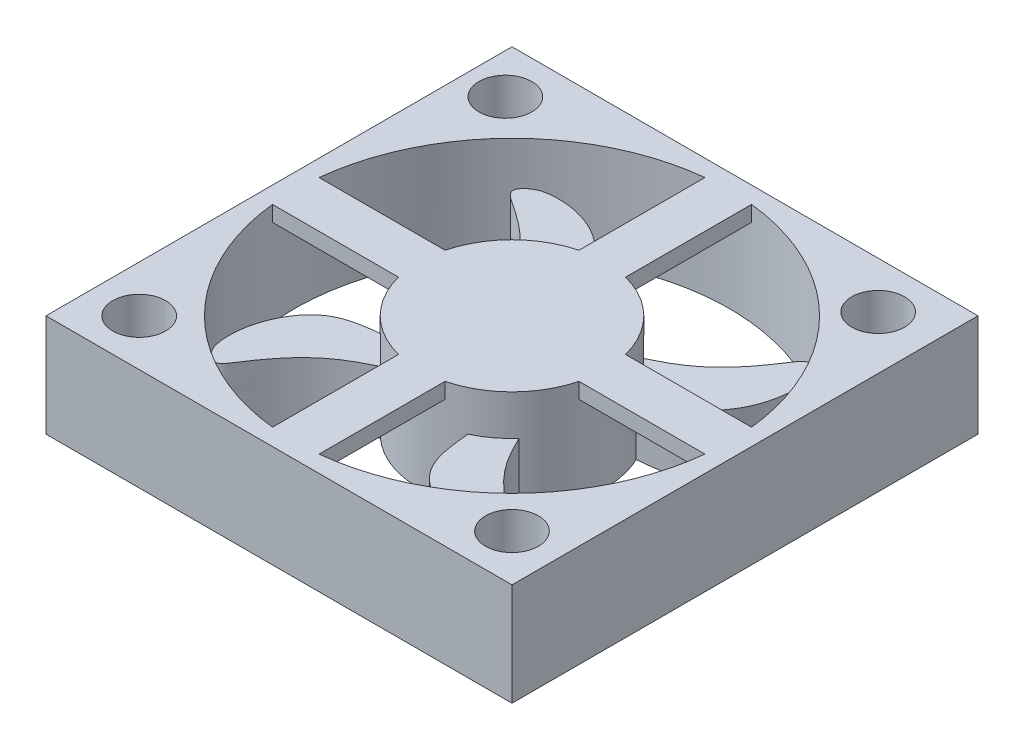
ISO-10303-21;
HEADER;
FILE_DESCRIPTION(('STEP AP214'),'2;1');
FILE_NAME('part.step','',(''),(''),'','','');
FILE_SCHEMA(('AUTOMOTIVE_DESIGN { 1 0 10303 214 1 1 1 1 }'));
ENDSEC;
DATA;
#1=APPLICATION_CONTEXT('core data for automotive mechanical design processes');
#2=APPLICATION_PROTOCOL_DEFINITION('international standard','automotive_design',2000,#1);
#3=PRODUCT_CONTEXT('',#1,'mechanical');
#4=PRODUCT('Part','Part','',(#3));
#5=PRODUCT_RELATED_PRODUCT_CATEGORY('part','',(#4));
#6=PRODUCT_DEFINITION_FORMATION('','',#4);
#7=PRODUCT_DEFINITION_CONTEXT('part definition',#1,'design');
#8=PRODUCT_DEFINITION('design','',#6,#7);
#9=PRODUCT_DEFINITION_SHAPE('','',#8);
#10=(LENGTH_UNIT() NAMED_UNIT(*) SI_UNIT(.MILLI.,.METRE.));
#11=(NAMED_UNIT(*) PLANE_ANGLE_UNIT() SI_UNIT($,.RADIAN.));
#12=(NAMED_UNIT(*) SI_UNIT($,.STERADIAN.) SOLID_ANGLE_UNIT());
#13=UNCERTAINTY_MEASURE_WITH_UNIT(LENGTH_MEASURE(1.E-05),#10,'distance_accuracy_value','');
#14=(GEOMETRIC_REPRESENTATION_CONTEXT(3) GLOBAL_UNCERTAINTY_ASSIGNED_CONTEXT((#13)) GLOBAL_UNIT_ASSIGNED_CONTEXT((#10,
#11,#12)) REPRESENTATION_CONTEXT('',''));
#15=CARTESIAN_POINT('',(0.,0.,0.));
#16=DIRECTION('',(0.,0.,1.));
#17=DIRECTION('',(1.,0.,0.));
#18=AXIS2_PLACEMENT_3D('',#15,#16,#17);
#19=CARTESIAN_POINT('',(15.,6.6,-15.));
#20=DIRECTION('',(0.,-1.,0.));
#21=DIRECTION('',(0.,0.,-1.));
#22=AXIS2_PLACEMENT_3D('',#19,#20,#21);
#23=CYLINDRICAL_SURFACE('',#22,6.);
#24=CARTESIAN_POINT('',(15.,5.6,-15.));
#25=DIRECTION('',(0.,-1.,0.));
#26=DIRECTION('',(0.,0.,1.));
#27=AXIS2_PLACEMENT_3D('',#24,#25,#26);
#28=CIRCLE('',#27,6.);
#29=CARTESIAN_POINT('',(9.19052498068887,5.6,-13.5));
#30=VERTEX_POINT('',#29);
#31=CARTESIAN_POINT('',(9.19052498068888,5.6,-16.5));
#32=VERTEX_POINT('',#31);
#33=EDGE_CURVE('E425',#30,#32,#28,.T.);
#34=ORIENTED_EDGE('',*,*,#33,.T.);
#35=DIRECTION('',(0.,1.,0.));
#36=VECTOR('',#35,1.);
#37=CARTESIAN_POINT('',(9.19052498068888,5.6,-16.5));
#38=LINE('',#37,#36);
#39=CARTESIAN_POINT('',(9.19052498068888,6.6,-16.5));
#40=VERTEX_POINT('',#39);
#41=EDGE_CURVE('E427',#32,#40,#38,.T.);
#42=ORIENTED_EDGE('',*,*,#41,.T.);
#43=CARTESIAN_POINT('',(15.,6.6,-15.));
#44=DIRECTION('',(0.,1.,0.));
#45=DIRECTION('',(0.,0.,1.));
#46=AXIS2_PLACEMENT_3D('',#43,#44,#45);
#47=CIRCLE('',#46,6.);
#48=CARTESIAN_POINT('',(13.5,6.6,-20.8094750193111));
#49=VERTEX_POINT('',#48);
#50=EDGE_CURVE('E12',#49,#40,#47,.T.);
#51=ORIENTED_EDGE('',*,*,#50,.F.);
#52=DIRECTION('',(0.,1.,0.));
#53=VECTOR('',#52,1.);
#54=CARTESIAN_POINT('',(13.5,5.6,-20.8094750193111));
#55=LINE('',#54,#53);
#56=CARTESIAN_POINT('',(13.5,5.6,-20.8094750193111));
#57=VERTEX_POINT('',#56);
#58=EDGE_CURVE('E575',#57,#49,#55,.T.);
#59=ORIENTED_EDGE('',*,*,#58,.F.);
#60=CARTESIAN_POINT('',(15.,5.6,-15.));
#61=DIRECTION('',(0.,-1.,0.));
#62=DIRECTION('',(0.,0.,1.));
#63=AXIS2_PLACEMENT_3D('',#60,#61,#62);
#64=CIRCLE('',#63,6.);
#65=CARTESIAN_POINT('',(16.5,5.6,-20.8094750193111));
#66=VERTEX_POINT('',#65);
#67=EDGE_CURVE('E560',#57,#66,#64,.T.);
#68=ORIENTED_EDGE('',*,*,#67,.T.);
#69=DIRECTION('',(0.,1.,0.));
#70=VECTOR('',#69,1.);
#71=CARTESIAN_POINT('',(16.5,5.6,-20.8094750193111));
#72=LINE('',#71,#70);
#73=CARTESIAN_POINT('',(16.5,6.6,-20.8094750193111));
#74=VERTEX_POINT('',#73);
#75=EDGE_CURVE('E572',#66,#74,#72,.T.);
#76=ORIENTED_EDGE('',*,*,#75,.T.);
#77=CARTESIAN_POINT('',(20.8094750193111,6.6,-16.5));
#78=VERTEX_POINT('',#77);
#79=EDGE_CURVE('E59',#78,#74,#47,.T.);
#80=ORIENTED_EDGE('',*,*,#79,.F.);
#81=DIRECTION('',(0.,1.,0.));
#82=VECTOR('',#81,1.);
#83=CARTESIAN_POINT('',(20.8094750193111,5.6,-16.5));
#84=LINE('',#83,#82);
#85=CARTESIAN_POINT('',(20.8094750193111,5.6,-16.5));
#86=VERTEX_POINT('',#85);
#87=EDGE_CURVE('E509',#86,#78,#84,.T.);
#88=ORIENTED_EDGE('',*,*,#87,.F.);
#89=CARTESIAN_POINT('',(15.,5.6,-15.));
#90=DIRECTION('',(0.,-1.,0.));
#91=DIRECTION('',(0.,0.,1.));
#92=AXIS2_PLACEMENT_3D('',#89,#90,#91);
#93=CIRCLE('',#92,6.);
#94=CARTESIAN_POINT('',(20.8094750193111,5.6,-13.5));
#95=VERTEX_POINT('',#94);
#96=EDGE_CURVE('E492',#86,#95,#93,.T.);
#97=ORIENTED_EDGE('',*,*,#96,.T.);
#98=DIRECTION('',(0.,1.,0.));
#99=VECTOR('',#98,1.);
#100=CARTESIAN_POINT('',(20.8094750193111,5.6,-13.5));
#101=LINE('',#100,#99);
#102=CARTESIAN_POINT('',(20.8094750193111,6.6,-13.5));
#103=VERTEX_POINT('',#102);
#104=EDGE_CURVE('E506',#95,#103,#101,.T.);
#105=ORIENTED_EDGE('',*,*,#104,.T.);
#106=CARTESIAN_POINT('',(16.5,6.6,-9.19052498068888));
#107=VERTEX_POINT('',#106);
#108=EDGE_CURVE('E914',#107,#103,#47,.T.);
#109=ORIENTED_EDGE('',*,*,#108,.F.);
#110=DIRECTION('',(0.,1.,0.));
#111=VECTOR('',#110,1.);
#112=CARTESIAN_POINT('',(16.5,5.6,-9.19052498068888));
#113=LINE('',#112,#111);
#114=CARTESIAN_POINT('',(16.5,5.6,-9.19052498068888));
#115=VERTEX_POINT('',#114);
#116=EDGE_CURVE('E481',#115,#107,#113,.T.);
#117=ORIENTED_EDGE('',*,*,#116,.F.);
#118=CARTESIAN_POINT('',(15.,5.6,-15.));
#119=DIRECTION('',(0.,-1.,0.));
#120=DIRECTION('',(0.,0.,1.));
#121=AXIS2_PLACEMENT_3D('',#118,#119,#120);
#122=CIRCLE('',#121,6.);
#123=CARTESIAN_POINT('',(13.5,5.6,-9.19052498068888));
#124=VERTEX_POINT('',#123);
#125=EDGE_CURVE('E464',#115,#124,#122,.T.);
#126=ORIENTED_EDGE('',*,*,#125,.T.);
#127=DIRECTION('',(0.,1.,0.));
#128=VECTOR('',#127,1.);
#129=CARTESIAN_POINT('',(13.5,5.6,-9.19052498068888));
#130=LINE('',#129,#128);
#131=CARTESIAN_POINT('',(13.5,6.6,-9.19052498068888));
#132=VERTEX_POINT('',#131);
#133=EDGE_CURVE('E478',#124,#132,#130,.T.);
#134=ORIENTED_EDGE('',*,*,#133,.T.);
#135=CARTESIAN_POINT('',(9.19052498068887,6.6,-13.5));
#136=VERTEX_POINT('',#135);
#137=EDGE_CURVE('E58',#136,#132,#47,.T.);
#138=ORIENTED_EDGE('',*,*,#137,.F.);
#139=DIRECTION('',(0.,1.,0.));
#140=VECTOR('',#139,1.);
#141=CARTESIAN_POINT('',(9.19052498068887,5.6,-13.5));
#142=LINE('',#141,#140);
#143=EDGE_CURVE('E430',#30,#136,#142,.T.);
#144=ORIENTED_EDGE('',*,*,#143,.F.);
#145=EDGE_LOOP('',(#34,#42,#51,#59,#68,#76,#80,#88,#97,#105,#109,#117,#126,#134,#138,#144));
#146=FACE_BOUND('',#145,.T.);
#147=CARTESIAN_POINT('',(15.,4.,-15.));
#148=DIRECTION('',(0.,1.,0.));
#149=DIRECTION('',(0.,0.,-1.));
#150=AXIS2_PLACEMENT_3D('',#147,#148,#149);
#151=CIRCLE('',#150,6.00000000000013);
#152=CARTESIAN_POINT('',(12.4167747672233,4.,-20.4154360301592));
#153=VERTEX_POINT('',#152);
#154=CARTESIAN_POINT('',(10.5417035218343,4.,-19.0154193445735));
#155=VERTEX_POINT('',#154);
#156=EDGE_CURVE('E71',#153,#155,#151,.T.);
#157=ORIENTED_EDGE('',*,*,#156,.T.);
#158=DIRECTION('',(0.,-1.,0.));
#159=VECTOR('',#158,1.);
#160=CARTESIAN_POINT('',(10.5417035218342,4.,-19.0154193445736));
#161=LINE('',#160,#159);
#162=CARTESIAN_POINT('',(10.5417035218342,0.,-19.0154193445736));
#163=VERTEX_POINT('',#162);
#164=EDGE_CURVE('E245',#155,#163,#161,.T.);
#165=ORIENTED_EDGE('',*,*,#164,.T.);
#166=CARTESIAN_POINT('',(15.,0.,-15.));
#167=DIRECTION('',(0.,1.,0.));
#168=DIRECTION('',(0.,0.,1.));
#169=AXIS2_PLACEMENT_3D('',#166,#167,#168);
#170=CIRCLE('',#169,6.);
#171=CARTESIAN_POINT('',(9.58456396984082,0.,-12.4167747672234));
#172=VERTEX_POINT('',#171);
#173=EDGE_CURVE('E236',#163,#172,#170,.T.);
#174=ORIENTED_EDGE('',*,*,#173,.T.);
#175=DIRECTION('',(0.,-1.,0.));
#176=VECTOR('',#175,1.);
#177=CARTESIAN_POINT('',(9.5845639698407,4.,-12.4167747672233));
#178=LINE('',#177,#176);
#179=CARTESIAN_POINT('',(9.58456396984083,4.,-12.4167747672234));
#180=VERTEX_POINT('',#179);
#181=EDGE_CURVE('E588',#180,#172,#178,.T.);
#182=ORIENTED_EDGE('',*,*,#181,.F.);
#183=CARTESIAN_POINT('',(15.,4.,-15.));
#184=DIRECTION('',(0.,1.,0.));
#185=DIRECTION('',(0.,0.,-1.));
#186=AXIS2_PLACEMENT_3D('',#183,#184,#185);
#187=CIRCLE('',#186,6.00000000000013);
#188=CARTESIAN_POINT('',(10.9845806554265,4.,-10.5417035218343));
#189=VERTEX_POINT('',#188);
#190=EDGE_CURVE('E331',#180,#189,#187,.T.);
#191=ORIENTED_EDGE('',*,*,#190,.T.);
#192=DIRECTION('',(0.,-1.,0.));
#193=VECTOR('',#192,1.);
#194=CARTESIAN_POINT('',(10.9845806554264,4.,-10.5417035218342));
#195=LINE('',#194,#193);
#196=CARTESIAN_POINT('',(10.9845806554264,0.,-10.5417035218342));
#197=VERTEX_POINT('',#196);
#198=EDGE_CURVE('E447',#189,#197,#195,.T.);
#199=ORIENTED_EDGE('',*,*,#198,.T.);
#200=CARTESIAN_POINT('',(17.5832252327766,0.,-9.58456396984083));
#201=VERTEX_POINT('',#200);
#202=EDGE_CURVE('E53',#197,#201,#170,.T.);
#203=ORIENTED_EDGE('',*,*,#202,.T.);
#204=DIRECTION('',(0.,-1.,0.));
#205=VECTOR('',#204,1.);
#206=CARTESIAN_POINT('',(17.5832252327767,4.,-9.58456396984062));
#207=LINE('',#206,#205);
#208=CARTESIAN_POINT('',(17.5832252327766,4.,-9.58456396984083));
#209=VERTEX_POINT('',#208);
#210=EDGE_CURVE('E311',#209,#201,#207,.T.);
#211=ORIENTED_EDGE('',*,*,#210,.F.);
#212=CARTESIAN_POINT('',(15.,4.,-15.));
#213=DIRECTION('',(0.,1.,0.));
#214=DIRECTION('',(0.,0.,-1.));
#215=AXIS2_PLACEMENT_3D('',#212,#213,#214);
#216=CIRCLE('',#215,6.00000000000024);
#217=CARTESIAN_POINT('',(19.4582964781657,4.,-10.9845806554265));
#218=VERTEX_POINT('',#217);
#219=EDGE_CURVE('E303',#209,#218,#216,.T.);
#220=ORIENTED_EDGE('',*,*,#219,.T.);
#221=DIRECTION('',(0.,-1.,0.));
#222=VECTOR('',#221,1.);
#223=CARTESIAN_POINT('',(19.4582964781659,4.,-10.9845806554263));
#224=LINE('',#223,#222);
#225=CARTESIAN_POINT('',(19.4582964781659,0.,-10.9845806554263));
#226=VERTEX_POINT('',#225);
#227=EDGE_CURVE('E317',#218,#226,#224,.T.);
#228=ORIENTED_EDGE('',*,*,#227,.T.);
#229=CARTESIAN_POINT('',(20.4154360301591,0.,-17.5832252327767));
#230=VERTEX_POINT('',#229);
#231=EDGE_CURVE('E913',#226,#230,#170,.T.);
#232=ORIENTED_EDGE('',*,*,#231,.T.);
#233=DIRECTION('',(0.,-1.,0.));
#234=VECTOR('',#233,1.);
#235=CARTESIAN_POINT('',(20.4154360301592,4.,-17.5832252327768));
#236=LINE('',#235,#234);
#237=CARTESIAN_POINT('',(20.4154360301592,4.,-17.5832252327766));
#238=VERTEX_POINT('',#237);
#239=EDGE_CURVE('E305',#238,#230,#236,.T.);
#240=ORIENTED_EDGE('',*,*,#239,.F.);
#241=CARTESIAN_POINT('',(15.,4.,-15.));
#242=DIRECTION('',(0.,1.,0.));
#243=DIRECTION('',(0.,0.,-1.));
#244=AXIS2_PLACEMENT_3D('',#241,#242,#243);
#245=CIRCLE('',#244,6.00000000000013);
#246=CARTESIAN_POINT('',(19.0154193445735,4.,-19.4582964781657));
#247=VERTEX_POINT('',#246);
#248=EDGE_CURVE('E272',#238,#247,#245,.T.);
#249=ORIENTED_EDGE('',*,*,#248,.T.);
#250=DIRECTION('',(0.,-1.,0.));
#251=VECTOR('',#250,1.);
#252=CARTESIAN_POINT('',(19.0154193445736,4.,-19.4582964781658));
#253=LINE('',#252,#251);
#254=CARTESIAN_POINT('',(19.0154193445736,0.,-19.4582964781658));
#255=VERTEX_POINT('',#254);
#256=EDGE_CURVE('E316',#247,#255,#253,.T.);
#257=ORIENTED_EDGE('',*,*,#256,.T.);
#258=CARTESIAN_POINT('',(12.4167747672233,0.,-20.4154360301592));
#259=VERTEX_POINT('',#258);
#260=EDGE_CURVE('E243',#255,#259,#170,.T.);
#261=ORIENTED_EDGE('',*,*,#260,.T.);
#262=DIRECTION('',(0.,-1.,0.));
#263=VECTOR('',#262,1.);
#264=CARTESIAN_POINT('',(12.4167747672233,4.,-20.4154360301593));
#265=LINE('',#264,#263);
#266=EDGE_CURVE('E66',#153,#259,#265,.T.);
#267=ORIENTED_EDGE('',*,*,#266,.F.);
#268=EDGE_LOOP('',(#157,#165,#174,#182,#191,#199,#203,#211,#220,#228,#232,#240,#249,#257,#261,#267));
#269=FACE_BOUND('',#268,.T.);
#270=ADVANCED_FACE('F50',(#146,#269),#23,.T.);
#271=CARTESIAN_POINT('',(0.,6.6,0.));
#272=DIRECTION('',(0.,1.,0.));
#273=DIRECTION('',(0.,0.,1.));
#274=AXIS2_PLACEMENT_3D('',#271,#272,#273);
#275=PLANE('',#274);
#276=CARTESIAN_POINT('',(3.,6.6,-3.));
#277=DIRECTION('',(0.,1.,0.));
#278=DIRECTION('',(0.,0.,1.));
#279=AXIS2_PLACEMENT_3D('',#276,#277,#278);
#280=CIRCLE('',#279,1.7);
#281=CARTESIAN_POINT('',(3.,6.6,-1.3));
#282=VERTEX_POINT('',#281);
#283=EDGE_CURVE('E869',#282,#282,#280,.T.);
#284=ORIENTED_EDGE('',*,*,#283,.F.);
#285=EDGE_LOOP('',(#284));
#286=FACE_BOUND('',#285,.T.);
#287=CARTESIAN_POINT('',(27.,6.6,-3.));
#288=DIRECTION('',(0.,1.,0.));
#289=DIRECTION('',(0.,0.,1.));
#290=AXIS2_PLACEMENT_3D('',#287,#288,#289);
#291=CIRCLE('',#290,1.7);
#292=CARTESIAN_POINT('',(27.,6.6,-1.3));
#293=VERTEX_POINT('',#292);
#294=EDGE_CURVE('E863',#293,#293,#291,.T.);
#295=ORIENTED_EDGE('',*,*,#294,.F.);
#296=EDGE_LOOP('',(#295));
#297=FACE_BOUND('',#296,.T.);
#298=CARTESIAN_POINT('',(26.571237945882,6.6,-27.));
#299=DIRECTION('',(0.,1.,0.));
#300=DIRECTION('',(0.,0.,1.));
#301=AXIS2_PLACEMENT_3D('',#298,#299,#300);
#302=CIRCLE('',#301,1.7);
#303=CARTESIAN_POINT('',(26.571237945882,6.6,-25.3));
#304=VERTEX_POINT('',#303);
#305=EDGE_CURVE('E857',#304,#304,#302,.T.);
#306=ORIENTED_EDGE('',*,*,#305,.F.);
#307=EDGE_LOOP('',(#306));
#308=FACE_BOUND('',#307,.T.);
#309=CARTESIAN_POINT('',(2.57123794588199,6.6,-27.));
#310=DIRECTION('',(0.,1.,0.));
#311=DIRECTION('',(0.,0.,1.));
#312=AXIS2_PLACEMENT_3D('',#309,#310,#311);
#313=CIRCLE('',#312,1.7);
#314=CARTESIAN_POINT('',(2.57123794588199,6.6,-25.3));
#315=VERTEX_POINT('',#314);
#316=EDGE_CURVE('E256',#315,#315,#313,.T.);
#317=ORIENTED_EDGE('',*,*,#316,.F.);
#318=EDGE_LOOP('',(#317));
#319=FACE_BOUND('',#318,.T.);
#320=ORIENTED_EDGE('',*,*,#50,.T.);
#321=DIRECTION('',(-1.,0.,0.));
#322=VECTOR('',#321,1.);
#323=CARTESIAN_POINT('',(1.08058909292494,6.6,-16.5));
#324=LINE('',#323,#322);
#325=CARTESIAN_POINT('',(1.08058909292494,6.6,-16.5));
#326=VERTEX_POINT('',#325);
#327=EDGE_CURVE('E446',#40,#326,#324,.T.);
#328=ORIENTED_EDGE('',*,*,#327,.T.);
#329=CARTESIAN_POINT('',(15.,6.6,-15.));
#330=DIRECTION('',(0.,1.,0.));
#331=DIRECTION('',(0.,0.,1.));
#332=AXIS2_PLACEMENT_3D('',#329,#330,#331);
#333=CIRCLE('',#332,14.);
#334=CARTESIAN_POINT('',(13.5,6.6,-28.9194109070751));
#335=VERTEX_POINT('',#334);
#336=EDGE_CURVE('E514',#335,#326,#333,.T.);
#337=ORIENTED_EDGE('',*,*,#336,.F.);
#338=DIRECTION('',(0.,0.,1.));
#339=VECTOR('',#338,1.);
#340=CARTESIAN_POINT('',(13.5,6.6,-28.9194109070751));
#341=LINE('',#340,#339);
#342=EDGE_CURVE('E552',#335,#49,#341,.T.);
#343=ORIENTED_EDGE('',*,*,#342,.T.);
#344=EDGE_LOOP('',(#320,#328,#337,#343));
#345=FACE_BOUND('',#344,.T.);
#346=DIRECTION('',(1.,0.,0.));
#347=VECTOR('',#346,1.);
#348=CARTESIAN_POINT('',(1.08058909292495,6.6,-13.5));
#349=LINE('',#348,#347);
#350=CARTESIAN_POINT('',(1.08058909292495,6.6,-13.5));
#351=VERTEX_POINT('',#350);
#352=EDGE_CURVE('E444',#351,#136,#349,.T.);
#353=ORIENTED_EDGE('',*,*,#352,.T.);
#354=ORIENTED_EDGE('',*,*,#137,.T.);
#355=DIRECTION('',(0.,0.,1.));
#356=VECTOR('',#355,1.);
#357=CARTESIAN_POINT('',(13.5,6.6,-9.19052498068888));
#358=LINE('',#357,#356);
#359=CARTESIAN_POINT('',(13.5,6.6,-1.08058909292494));
#360=VERTEX_POINT('',#359);
#361=EDGE_CURVE('E461',#132,#360,#358,.T.);
#362=ORIENTED_EDGE('',*,*,#361,.T.);
#363=EDGE_CURVE('E517',#351,#360,#333,.T.);
#364=ORIENTED_EDGE('',*,*,#363,.F.);
#365=EDGE_LOOP('',(#353,#354,#362,#364));
#366=FACE_BOUND('',#365,.T.);
#367=DIRECTION('',(0.,0.,-1.));
#368=VECTOR('',#367,1.);
#369=CARTESIAN_POINT('',(16.5,6.6,-9.19052498068888));
#370=LINE('',#369,#368);
#371=CARTESIAN_POINT('',(16.5,6.6,-1.08058909292495));
#372=VERTEX_POINT('',#371);
#373=EDGE_CURVE('E453',#372,#107,#370,.T.);
#374=ORIENTED_EDGE('',*,*,#373,.T.);
#375=ORIENTED_EDGE('',*,*,#108,.T.);
#376=DIRECTION('',(1.,0.,0.));
#377=VECTOR('',#376,1.);
#378=CARTESIAN_POINT('',(20.8094750193111,6.6,-13.5));
#379=LINE('',#378,#377);
#380=CARTESIAN_POINT('',(28.9194109070751,6.6,-13.5));
#381=VERTEX_POINT('',#380);
#382=EDGE_CURVE('E489',#103,#381,#379,.T.);
#383=ORIENTED_EDGE('',*,*,#382,.T.);
#384=EDGE_CURVE('E929',#372,#381,#333,.T.);
#385=ORIENTED_EDGE('',*,*,#384,.F.);
#386=EDGE_LOOP('',(#374,#375,#383,#385));
#387=FACE_BOUND('',#386,.T.);
#388=DIRECTION('',(-1.,0.,0.));
#389=VECTOR('',#388,1.);
#390=CARTESIAN_POINT('',(20.8094750193111,6.6,-16.5));
#391=LINE('',#390,#389);
#392=CARTESIAN_POINT('',(28.9194109070751,6.6,-16.5));
#393=VERTEX_POINT('',#392);
#394=EDGE_CURVE('E477',#393,#78,#391,.T.);
#395=ORIENTED_EDGE('',*,*,#394,.T.);
#396=ORIENTED_EDGE('',*,*,#79,.T.);
#397=DIRECTION('',(0.,0.,-1.));
#398=VECTOR('',#397,1.);
#399=CARTESIAN_POINT('',(16.5,6.6,-28.9194109070751));
#400=LINE('',#399,#398);
#401=CARTESIAN_POINT('',(16.5,6.6,-28.9194109070751));
#402=VERTEX_POINT('',#401);
#403=EDGE_CURVE('E557',#74,#402,#400,.T.);
#404=ORIENTED_EDGE('',*,*,#403,.T.);
#405=EDGE_CURVE('E518',#393,#402,#333,.T.);
#406=ORIENTED_EDGE('',*,*,#405,.F.);
#407=EDGE_LOOP('',(#395,#396,#404,#406));
#408=FACE_BOUND('',#407,.T.);
#409=DIRECTION('',(1.,0.,0.));
#410=VECTOR('',#409,1.);
#411=CARTESIAN_POINT('',(0.,6.6,0.));
#412=LINE('',#411,#410);
#413=CARTESIAN_POINT('',(0.,6.6,0.));
#414=VERTEX_POINT('',#413);
#415=CARTESIAN_POINT('',(30.,6.6,0.));
#416=VERTEX_POINT('',#415);
#417=EDGE_CURVE('E516',#414,#416,#412,.T.);
#418=ORIENTED_EDGE('',*,*,#417,.T.);
#419=DIRECTION('',(0.,0.,-1.));
#420=VECTOR('',#419,1.);
#421=CARTESIAN_POINT('',(30.,6.6,0.));
#422=LINE('',#421,#420);
#423=CARTESIAN_POINT('',(30.,6.6,-30.));
#424=VERTEX_POINT('',#423);
#425=EDGE_CURVE('E521',#416,#424,#422,.T.);
#426=ORIENTED_EDGE('',*,*,#425,.T.);
#427=DIRECTION('',(1.,0.,0.));
#428=VECTOR('',#427,1.);
#429=CARTESIAN_POINT('',(0.,6.6,-30.));
#430=LINE('',#429,#428);
#431=CARTESIAN_POINT('',(0.,6.6,-30.));
#432=VERTEX_POINT('',#431);
#433=EDGE_CURVE('E523',#432,#424,#430,.T.);
#434=ORIENTED_EDGE('',*,*,#433,.F.);
#435=DIRECTION('',(0.,0.,-1.));
#436=VECTOR('',#435,1.);
#437=CARTESIAN_POINT('',(0.,6.6,0.));
#438=LINE('',#437,#436);
#439=EDGE_CURVE('E526',#414,#432,#438,.T.);
#440=ORIENTED_EDGE('',*,*,#439,.F.);
#441=EDGE_LOOP('',(#418,#426,#434,#440));
#442=FACE_BOUND('',#441,.T.);
#443=ADVANCED_FACE('F412',(#286,#297,#308,#319,#345,#366,#387,#408,#442),#275,.T.);
#444=CARTESIAN_POINT('',(0.,0.,0.));
#445=DIRECTION('',(0.,1.,0.));
#446=DIRECTION('',(0.,0.,1.));
#447=AXIS2_PLACEMENT_3D('',#444,#445,#446);
#448=PLANE('',#447);
#449=ORIENTED_EDGE('',*,*,#202,.F.);
#450=CARTESIAN_POINT('',(10.9845806554264,0.,-10.5417035218342));
#451=CARTESIAN_POINT('',(9.50750796774688,0.,-9.81269781176058));
#452=CARTESIAN_POINT('',(7.83469695883329,0.,-8.98708591903253));
#453=CARTESIAN_POINT('',(5.38744929694203,0.,-4.93836486210495));
#454=CARTESIAN_POINT('',(4.56953198977358,0.,-6.05828786585223));
#455=CARTESIAN_POINT('',(4.10375747161934,0.,-8.18543142874282));
#456=CARTESIAN_POINT('',(5.38069333421927,0.,-12.0320756950052));
#457=CARTESIAN_POINT('',(8.41080873166696,0.,-12.3093636239521));
#458=CARTESIAN_POINT('',(9.5845639698407,0.,-12.4167747672233));
#459=B_SPLINE_CURVE_WITH_KNOTS('',3,(#450,#451,#452,#453,#454,#455,#456,#457,#458),
.UNSPECIFIED.,.F.,.F.,(4,1,1,1,1,1,4),(0.,0.326772786573244,0.370075974833607,0.433031882603628,
0.445679734454528,0.714594249874362,0.884625813802364),.UNSPECIFIED.);
#460=EDGE_CURVE('E241',#197,#172,#459,.T.);
#461=ORIENTED_EDGE('',*,*,#460,.T.);
#462=ORIENTED_EDGE('',*,*,#173,.F.);
#463=CARTESIAN_POINT('',(10.5417035218342,0.,-19.0154193445736));
#464=CARTESIAN_POINT('',(9.81269781176075,0.,-20.4924920322531));
#465=CARTESIAN_POINT('',(8.98708591903294,0.,-22.1653030411666));
#466=CARTESIAN_POINT('',(4.93836486210532,0.,-24.6125507030579));
#467=CARTESIAN_POINT('',(6.0582878658526,0.,-25.4304680102263));
#468=CARTESIAN_POINT('',(8.18543142874317,0.,-25.8962425283806));
#469=CARTESIAN_POINT('',(12.0320756950058,0.,-24.6193066657807));
#470=CARTESIAN_POINT('',(12.3093636239522,0.,-21.589191268333));
#471=CARTESIAN_POINT('',(12.4167747672233,0.,-20.4154360301593));
#472=B_SPLINE_CURVE_WITH_KNOTS('',3,(#463,#464,#465,#466,#467,#468,#469,#470,#471),
.UNSPECIFIED.,.F.,.F.,(4,1,1,1,1,1,4),(0.,0.326772786573244,0.370075974833607,0.433031882603628,
0.445679734454528,0.714594249874362,0.884625813802364),.UNSPECIFIED.);
#473=EDGE_CURVE('E239',#163,#259,#472,.T.);
#474=ORIENTED_EDGE('',*,*,#473,.T.);
#475=ORIENTED_EDGE('',*,*,#260,.F.);
#476=CARTESIAN_POINT('',(19.0154193445736,0.,-19.4582964781658));
#477=CARTESIAN_POINT('',(20.4924920322533,0.,-20.1873021882392));
#478=CARTESIAN_POINT('',(22.1653030411672,0.,-21.0129140809671));
#479=CARTESIAN_POINT('',(24.6125507030584,0.,-25.0616351378947));
#480=CARTESIAN_POINT('',(25.4304680102269,0.,-23.9417121341474));
#481=CARTESIAN_POINT('',(25.8962425283811,0.,-21.8145685712568));
#482=CARTESIAN_POINT('',(24.6193066657815,0.,-17.9679243049942));
#483=CARTESIAN_POINT('',(21.5891912683332,0.,-17.6906363760478));
#484=CARTESIAN_POINT('',(20.4154360301593,0.,-17.5832252327767));
#485=B_SPLINE_CURVE_WITH_KNOTS('',3,(#476,#477,#478,#479,#480,#481,#482,#483,#484),
.UNSPECIFIED.,.F.,.F.,(4,1,1,1,1,1,4),(0.,0.326772786573244,0.370075974833607,0.433031882603628,
0.445679734454528,0.714594249874362,0.884625813802364),.UNSPECIFIED.);
#486=EDGE_CURVE('E248',#255,#230,#485,.T.);
#487=ORIENTED_EDGE('',*,*,#486,.T.);
#488=ORIENTED_EDGE('',*,*,#231,.F.);
#489=CARTESIAN_POINT('',(19.4582964781658,0.,-10.9845806554264));
#490=CARTESIAN_POINT('',(20.1873021882394,0.,-9.50750796774667));
#491=CARTESIAN_POINT('',(21.0129140809675,0.,-7.83469695883283));
#492=CARTESIAN_POINT('',(25.0616351378951,0.,-5.38744929694158));
#493=CARTESIAN_POINT('',(23.9417121341478,0.,-4.56953198977313));
#494=CARTESIAN_POINT('',(21.8145685712573,0.,-4.10375747161888));
#495=CARTESIAN_POINT('',(17.9679243049948,0.,-5.38069333421857));
#496=CARTESIAN_POINT('',(17.690636376048,0.,-8.41080873166677));
#497=CARTESIAN_POINT('',(17.5832252327767,0.,-9.58456396984071));
#498=B_SPLINE_CURVE_WITH_KNOTS('',3,(#489,#490,#491,#492,#493,#494,#495,#496,#497),
.UNSPECIFIED.,.F.,.F.,(4,1,1,1,1,1,4),(0.,0.326772786573244,0.370075974833607,0.433031882603628,
0.445679734454528,0.714594249874362,0.884625813802364),.UNSPECIFIED.);
#499=EDGE_CURVE('E304',#226,#201,#498,.T.);
#500=ORIENTED_EDGE('',*,*,#499,.T.);
#501=EDGE_LOOP('',(#449,#461,#462,#474,#475,#487,#488,#500));
#502=FACE_BOUND('',#501,.T.);
#503=ADVANCED_FACE('F237',(#502),#448,.F.);
#504=CARTESIAN_POINT('',(16.5,5.6,-28.9194109070751));
#505=DIRECTION('',(1.,0.,0.));
#506=DIRECTION('',(0.,0.,-1.));
#507=AXIS2_PLACEMENT_3D('',#504,#505,#506);
#508=PLANE('',#507);
#509=ORIENTED_EDGE('',*,*,#403,.F.);
#510=ORIENTED_EDGE('',*,*,#75,.F.);
#511=DIRECTION('',(0.,0.,-1.));
#512=VECTOR('',#511,1.);
#513=CARTESIAN_POINT('',(16.5,5.6,-28.9194109070751));
#514=LINE('',#513,#512);
#515=CARTESIAN_POINT('',(16.5,5.6,-28.9194109070751));
#516=VERTEX_POINT('',#515);
#517=EDGE_CURVE('E563',#66,#516,#514,.T.);
#518=ORIENTED_EDGE('',*,*,#517,.T.);
#519=DIRECTION('',(0.,1.,0.));
#520=VECTOR('',#519,1.);
#521=CARTESIAN_POINT('',(16.5,5.6,-28.9194109070751));
#522=LINE('',#521,#520);
#523=EDGE_CURVE('E244',#516,#402,#522,.T.);
#524=ORIENTED_EDGE('',*,*,#523,.T.);
#525=EDGE_LOOP('',(#509,#510,#518,#524));
#526=FACE_BOUND('',#525,.T.);
#527=ADVANCED_FACE('F405',(#526),#508,.T.);
#528=CARTESIAN_POINT('',(13.5,5.6,-28.9194109070751));
#529=DIRECTION('',(-1.,0.,0.));
#530=DIRECTION('',(0.,0.,1.));
#531=AXIS2_PLACEMENT_3D('',#528,#529,#530);
#532=PLANE('',#531);
#533=ORIENTED_EDGE('',*,*,#342,.F.);
#534=DIRECTION('',(0.,1.,0.));
#535=VECTOR('',#534,1.);
#536=CARTESIAN_POINT('',(13.5,5.6,-28.9194109070751));
#537=LINE('',#536,#535);
#538=CARTESIAN_POINT('',(13.5,5.6,-28.9194109070751));
#539=VERTEX_POINT('',#538);
#540=EDGE_CURVE('E566',#539,#335,#537,.T.);
#541=ORIENTED_EDGE('',*,*,#540,.F.);
#542=DIRECTION('',(0.,0.,1.));
#543=VECTOR('',#542,1.);
#544=CARTESIAN_POINT('',(13.5,5.6,-28.9194109070751));
#545=LINE('',#544,#543);
#546=EDGE_CURVE('E556',#539,#57,#545,.T.);
#547=ORIENTED_EDGE('',*,*,#546,.T.);
#548=ORIENTED_EDGE('',*,*,#58,.T.);
#549=EDGE_LOOP('',(#533,#541,#547,#548));
#550=FACE_BOUND('',#549,.T.);
#551=ADVANCED_FACE('F403',(#550),#532,.T.);
#552=CARTESIAN_POINT('',(15.,5.6,-15.));
#553=DIRECTION('',(0.,1.,0.));
#554=DIRECTION('',(0.,0.,1.));
#555=AXIS2_PLACEMENT_3D('',#552,#553,#554);
#556=PLANE('',#555);
#557=CARTESIAN_POINT('',(15.,5.6,-15.));
#558=DIRECTION('',(0.,1.,0.));
#559=DIRECTION('',(0.,0.,1.));
#560=AXIS2_PLACEMENT_3D('',#557,#558,#559);
#561=CIRCLE('',#560,14.);
#562=EDGE_CURVE('E553',#516,#539,#561,.T.);
#563=ORIENTED_EDGE('',*,*,#562,.F.);
#564=ORIENTED_EDGE('',*,*,#517,.F.);
#565=ORIENTED_EDGE('',*,*,#67,.F.);
#566=ORIENTED_EDGE('',*,*,#546,.F.);
#567=EDGE_LOOP('',(#563,#564,#565,#566));
#568=FACE_BOUND('',#567,.T.);
#569=ADVANCED_FACE('F396',(#568),#556,.F.);
#570=CARTESIAN_POINT('',(0.,6.6,0.));
#571=DIRECTION('',(0.,0.,-1.));
#572=DIRECTION('',(-1.,0.,0.));
#573=AXIS2_PLACEMENT_3D('',#570,#571,#572);
#574=PLANE('',#573);
#575=DIRECTION('',(1.,0.,0.));
#576=VECTOR('',#575,1.);
#577=CARTESIAN_POINT('',(0.,0.,0.));
#578=LINE('',#577,#576);
#579=CARTESIAN_POINT('',(0.,0.,0.));
#580=VERTEX_POINT('',#579);
#581=CARTESIAN_POINT('',(30.,0.,0.));
#582=VERTEX_POINT('',#581);
#583=EDGE_CURVE('E532',#580,#582,#578,.T.);
#584=ORIENTED_EDGE('',*,*,#583,.T.);
#585=DIRECTION('',(0.,-1.,0.));
#586=VECTOR('',#585,1.);
#587=CARTESIAN_POINT('',(30.,6.6,0.));
#588=LINE('',#587,#586);
#589=EDGE_CURVE('E549',#416,#582,#588,.T.);
#590=ORIENTED_EDGE('',*,*,#589,.F.);
#591=ORIENTED_EDGE('',*,*,#417,.F.);
#592=DIRECTION('',(0.,-1.,0.));
#593=VECTOR('',#592,1.);
#594=CARTESIAN_POINT('',(0.,6.6,0.));
#595=LINE('',#594,#593);
#596=EDGE_CURVE('E529',#414,#580,#595,.T.);
#597=ORIENTED_EDGE('',*,*,#596,.T.);
#598=EDGE_LOOP('',(#584,#590,#591,#597));
#599=FACE_BOUND('',#598,.T.);
#600=ADVANCED_FACE('F392',(#599),#574,.F.);
#601=CARTESIAN_POINT('',(30.,6.6,0.));
#602=DIRECTION('',(-1.,0.,0.));
#603=DIRECTION('',(0.,0.,1.));
#604=AXIS2_PLACEMENT_3D('',#601,#602,#603);
#605=PLANE('',#604);
#606=DIRECTION('',(0.,0.,-1.));
#607=VECTOR('',#606,1.);
#608=CARTESIAN_POINT('',(30.,0.,0.));
#609=LINE('',#608,#607);
#610=CARTESIAN_POINT('',(30.,0.,-30.));
#611=VERTEX_POINT('',#610);
#612=EDGE_CURVE('E535',#582,#611,#609,.T.);
#613=ORIENTED_EDGE('',*,*,#612,.T.);
#614=DIRECTION('',(0.,-1.,0.));
#615=VECTOR('',#614,1.);
#616=CARTESIAN_POINT('',(30.,6.6,-30.));
#617=LINE('',#616,#615);
#618=EDGE_CURVE('E547',#424,#611,#617,.T.);
#619=ORIENTED_EDGE('',*,*,#618,.F.);
#620=ORIENTED_EDGE('',*,*,#425,.F.);
#621=ORIENTED_EDGE('',*,*,#589,.T.);
#622=EDGE_LOOP('',(#613,#619,#620,#621));
#623=FACE_BOUND('',#622,.T.);
#624=ADVANCED_FACE('F388',(#623),#605,.F.);
#625=CARTESIAN_POINT('',(0.,6.6,-30.));
#626=DIRECTION('',(0.,0.,-1.));
#627=DIRECTION('',(-1.,0.,0.));
#628=AXIS2_PLACEMENT_3D('',#625,#626,#627);
#629=PLANE('',#628);
#630=DIRECTION('',(1.,0.,0.));
#631=VECTOR('',#630,1.);
#632=CARTESIAN_POINT('',(0.,0.,-30.));
#633=LINE('',#632,#631);
#634=CARTESIAN_POINT('',(0.,0.,-30.));
#635=VERTEX_POINT('',#634);
#636=EDGE_CURVE('E538',#635,#611,#633,.T.);
#637=ORIENTED_EDGE('',*,*,#636,.F.);
#638=DIRECTION('',(0.,-1.,0.));
#639=VECTOR('',#638,1.);
#640=CARTESIAN_POINT('',(0.,6.6,-30.));
#641=LINE('',#640,#639);
#642=EDGE_CURVE('E545',#432,#635,#641,.T.);
#643=ORIENTED_EDGE('',*,*,#642,.F.);
#644=ORIENTED_EDGE('',*,*,#433,.T.);
#645=ORIENTED_EDGE('',*,*,#618,.T.);
#646=EDGE_LOOP('',(#637,#643,#644,#645));
#647=FACE_BOUND('',#646,.T.);
#648=ADVANCED_FACE('F385',(#647),#629,.T.);
#649=CARTESIAN_POINT('',(15.,6.6,-15.));
#650=DIRECTION('',(0.,-1.,0.));
#651=DIRECTION('',(0.,0.,-1.));
#652=AXIS2_PLACEMENT_3D('',#649,#650,#651);
#653=CYLINDRICAL_SURFACE('',#652,14.);
#654=DIRECTION('',(0.,1.,0.));
#655=VECTOR('',#654,1.);
#656=CARTESIAN_POINT('',(1.08058909292494,5.6,-16.5));
#657=LINE('',#656,#655);
#658=CARTESIAN_POINT('',(1.08058909292494,5.6,-16.5));
#659=VERTEX_POINT('',#658);
#660=EDGE_CURVE('E450',#659,#326,#657,.T.);
#661=ORIENTED_EDGE('',*,*,#660,.F.);
#662=CARTESIAN_POINT('',(15.,5.6,-15.));
#663=DIRECTION('',(0.,1.,0.));
#664=DIRECTION('',(0.,0.,1.));
#665=AXIS2_PLACEMENT_3D('',#662,#663,#664);
#666=CIRCLE('',#665,14.);
#667=CARTESIAN_POINT('',(1.08058909292494,5.6,-13.5));
#668=VERTEX_POINT('',#667);
#669=EDGE_CURVE('E440',#659,#668,#666,.T.);
#670=ORIENTED_EDGE('',*,*,#669,.T.);
#671=DIRECTION('',(0.,1.,0.));
#672=VECTOR('',#671,1.);
#673=CARTESIAN_POINT('',(1.08058909292495,5.6,-13.5));
#674=LINE('',#673,#672);
#675=EDGE_CURVE('E438',#668,#351,#674,.T.);
#676=ORIENTED_EDGE('',*,*,#675,.T.);
#677=ORIENTED_EDGE('',*,*,#363,.T.);
#678=DIRECTION('',(0.,1.,0.));
#679=VECTOR('',#678,1.);
#680=CARTESIAN_POINT('',(13.5,5.6,-1.08058909292495));
#681=LINE('',#680,#679);
#682=CARTESIAN_POINT('',(13.5,5.6,-1.08058909292494));
#683=VERTEX_POINT('',#682);
#684=EDGE_CURVE('E474',#683,#360,#681,.T.);
#685=ORIENTED_EDGE('',*,*,#684,.F.);
#686=CARTESIAN_POINT('',(15.,5.6,-15.));
#687=DIRECTION('',(0.,1.,0.));
#688=DIRECTION('',(0.,0.,1.));
#689=AXIS2_PLACEMENT_3D('',#686,#687,#688);
#690=CIRCLE('',#689,14.);
#691=CARTESIAN_POINT('',(16.5,5.6,-1.08058909292495));
#692=VERTEX_POINT('',#691);
#693=EDGE_CURVE('E458',#683,#692,#690,.T.);
#694=ORIENTED_EDGE('',*,*,#693,.T.);
#695=DIRECTION('',(0.,1.,0.));
#696=VECTOR('',#695,1.);
#697=CARTESIAN_POINT('',(16.5,5.6,-1.08058909292495));
#698=LINE('',#697,#696);
#699=EDGE_CURVE('E470',#692,#372,#698,.T.);
#700=ORIENTED_EDGE('',*,*,#699,.T.);
#701=ORIENTED_EDGE('',*,*,#384,.T.);
#702=DIRECTION('',(0.,1.,0.));
#703=VECTOR('',#702,1.);
#704=CARTESIAN_POINT('',(28.9194109070751,5.6,-13.5));
#705=LINE('',#704,#703);
#706=CARTESIAN_POINT('',(28.9194109070751,5.6,-13.5));
#707=VERTEX_POINT('',#706);
#708=EDGE_CURVE('E502',#707,#381,#705,.T.);
#709=ORIENTED_EDGE('',*,*,#708,.F.);
#710=CARTESIAN_POINT('',(15.,5.6,-15.));
#711=DIRECTION('',(0.,1.,0.));
#712=DIRECTION('',(0.,0.,1.));
#713=AXIS2_PLACEMENT_3D('',#710,#711,#712);
#714=CIRCLE('',#713,14.);
#715=CARTESIAN_POINT('',(28.9194109070751,5.6,-16.5));
#716=VERTEX_POINT('',#715);
#717=EDGE_CURVE('E486',#707,#716,#714,.T.);
#718=ORIENTED_EDGE('',*,*,#717,.T.);
#719=DIRECTION('',(0.,1.,0.));
#720=VECTOR('',#719,1.);
#721=CARTESIAN_POINT('',(28.9194109070751,5.6,-16.5));
#722=LINE('',#721,#720);
#723=EDGE_CURVE('E498',#716,#393,#722,.T.);
#724=ORIENTED_EDGE('',*,*,#723,.T.);
#725=ORIENTED_EDGE('',*,*,#405,.T.);
#726=ORIENTED_EDGE('',*,*,#523,.F.);
#727=ORIENTED_EDGE('',*,*,#562,.T.);
#728=ORIENTED_EDGE('',*,*,#540,.T.);
#729=ORIENTED_EDGE('',*,*,#336,.T.);
#730=EDGE_LOOP('',(#661,#670,#676,#677,#685,#694,#700,#701,#709,#718,#724,#725,#726,#727,#728,#729));
#731=FACE_BOUND('',#730,.T.);
#732=CARTESIAN_POINT('',(15.,0.,-15.));
#733=DIRECTION('',(0.,1.,0.));
#734=DIRECTION('',(0.,0.,1.));
#735=AXIS2_PLACEMENT_3D('',#732,#733,#734);
#736=CIRCLE('',#735,14.);
#737=CARTESIAN_POINT('',(15.,0.,-0.999999999999999));
#738=VERTEX_POINT('',#737);
#739=EDGE_CURVE('E505',#738,#738,#736,.T.);
#740=ORIENTED_EDGE('',*,*,#739,.F.);
#741=EDGE_LOOP('',(#740));
#742=FACE_BOUND('',#741,.T.);
#743=ADVANCED_FACE('F383',(#731,#742),#653,.F.);
#744=CARTESIAN_POINT('',(0.,6.6,0.));
#745=DIRECTION('',(-1.,0.,0.));
#746=DIRECTION('',(0.,0.,1.));
#747=AXIS2_PLACEMENT_3D('',#744,#745,#746);
#748=PLANE('',#747);
#749=DIRECTION('',(0.,0.,-1.));
#750=VECTOR('',#749,1.);
#751=CARTESIAN_POINT('',(0.,0.,0.));
#752=LINE('',#751,#750);
#753=EDGE_CURVE('E541',#580,#635,#752,.T.);
#754=ORIENTED_EDGE('',*,*,#753,.F.);
#755=ORIENTED_EDGE('',*,*,#596,.F.);
#756=ORIENTED_EDGE('',*,*,#439,.T.);
#757=ORIENTED_EDGE('',*,*,#642,.T.);
#758=EDGE_LOOP('',(#754,#755,#756,#757));
#759=FACE_BOUND('',#758,.T.);
#760=ADVANCED_FACE('F379',(#759),#748,.T.);
#761=CARTESIAN_POINT('',(0.,0.,0.));
#762=DIRECTION('',(0.,1.,0.));
#763=DIRECTION('',(0.,0.,1.));
#764=AXIS2_PLACEMENT_3D('',#761,#762,#763);
#765=PLANE('',#764);
#766=CARTESIAN_POINT('',(3.,0.,-3.));
#767=DIRECTION('',(0.,1.,0.));
#768=DIRECTION('',(0.,0.,1.));
#769=AXIS2_PLACEMENT_3D('',#766,#767,#768);
#770=CIRCLE('',#769,1.7);
#771=CARTESIAN_POINT('',(3.,0.,-1.3));
#772=VERTEX_POINT('',#771);
#773=EDGE_CURVE('E866',#772,#772,#770,.T.);
#774=ORIENTED_EDGE('',*,*,#773,.T.);
#775=EDGE_LOOP('',(#774));
#776=FACE_BOUND('',#775,.T.);
#777=CARTESIAN_POINT('',(27.,0.,-3.));
#778=DIRECTION('',(0.,1.,0.));
#779=DIRECTION('',(0.,0.,1.));
#780=AXIS2_PLACEMENT_3D('',#777,#778,#779);
#781=CIRCLE('',#780,1.7);
#782=CARTESIAN_POINT('',(27.,0.,-1.3));
#783=VERTEX_POINT('',#782);
#784=EDGE_CURVE('E860',#783,#783,#781,.T.);
#785=ORIENTED_EDGE('',*,*,#784,.T.);
#786=EDGE_LOOP('',(#785));
#787=FACE_BOUND('',#786,.T.);
#788=CARTESIAN_POINT('',(26.571237945882,0.,-27.));
#789=DIRECTION('',(0.,1.,0.));
#790=DIRECTION('',(0.,0.,1.));
#791=AXIS2_PLACEMENT_3D('',#788,#789,#790);
#792=CIRCLE('',#791,1.7);
#793=CARTESIAN_POINT('',(26.571237945882,0.,-25.3));
#794=VERTEX_POINT('',#793);
#795=EDGE_CURVE('E855',#794,#794,#792,.T.);
#796=ORIENTED_EDGE('',*,*,#795,.T.);
#797=EDGE_LOOP('',(#796));
#798=FACE_BOUND('',#797,.T.);
#799=CARTESIAN_POINT('',(2.57123794588199,0.,-27.));
#800=DIRECTION('',(0.,1.,0.));
#801=DIRECTION('',(0.,0.,1.));
#802=AXIS2_PLACEMENT_3D('',#799,#800,#801);
#803=CIRCLE('',#802,1.7);
#804=CARTESIAN_POINT('',(2.57123794588199,0.,-25.3));
#805=VERTEX_POINT('',#804);
#806=EDGE_CURVE('E252',#805,#805,#803,.T.);
#807=ORIENTED_EDGE('',*,*,#806,.T.);
#808=EDGE_LOOP('',(#807));
#809=FACE_BOUND('',#808,.T.);
#810=ORIENTED_EDGE('',*,*,#739,.T.);
#811=EDGE_LOOP('',(#810));
#812=FACE_BOUND('',#811,.T.);
#813=ORIENTED_EDGE('',*,*,#583,.F.);
#814=ORIENTED_EDGE('',*,*,#753,.T.);
#815=ORIENTED_EDGE('',*,*,#636,.T.);
#816=ORIENTED_EDGE('',*,*,#612,.F.);
#817=EDGE_LOOP('',(#813,#814,#815,#816));
#818=FACE_BOUND('',#817,.T.);
#819=ADVANCED_FACE('F372',(#776,#787,#798,#809,#812,#818),#765,.F.);
#820=CARTESIAN_POINT('',(20.8094750193111,5.6,-13.5));
#821=DIRECTION('',(0.,0.,1.));
#822=DIRECTION('',(1.,0.,0.));
#823=AXIS2_PLACEMENT_3D('',#820,#821,#822);
#824=PLANE('',#823);
#825=ORIENTED_EDGE('',*,*,#382,.F.);
#826=ORIENTED_EDGE('',*,*,#104,.F.);
#827=DIRECTION('',(1.,0.,0.));
#828=VECTOR('',#827,1.);
#829=CARTESIAN_POINT('',(20.8094750193111,5.6,-13.5));
#830=LINE('',#829,#828);
#831=EDGE_CURVE('E495',#95,#707,#830,.T.);
#832=ORIENTED_EDGE('',*,*,#831,.T.);
#833=ORIENTED_EDGE('',*,*,#708,.T.);
#834=EDGE_LOOP('',(#825,#826,#832,#833));
#835=FACE_BOUND('',#834,.T.);
#836=ADVANCED_FACE('F369',(#835),#824,.T.);
#837=CARTESIAN_POINT('',(20.8094750193111,5.6,-16.5));
#838=DIRECTION('',(0.,0.,-1.));
#839=DIRECTION('',(-1.,0.,0.));
#840=AXIS2_PLACEMENT_3D('',#837,#838,#839);
#841=PLANE('',#840);
#842=ORIENTED_EDGE('',*,*,#394,.F.);
#843=ORIENTED_EDGE('',*,*,#723,.F.);
#844=DIRECTION('',(-1.,0.,0.));
#845=VECTOR('',#844,1.);
#846=CARTESIAN_POINT('',(20.8094750193111,5.6,-16.5));
#847=LINE('',#846,#845);
#848=EDGE_CURVE('E488',#716,#86,#847,.T.);
#849=ORIENTED_EDGE('',*,*,#848,.T.);
#850=ORIENTED_EDGE('',*,*,#87,.T.);
#851=EDGE_LOOP('',(#842,#843,#849,#850));
#852=FACE_BOUND('',#851,.T.);
#853=ADVANCED_FACE('F367',(#852),#841,.T.);
#854=CARTESIAN_POINT('',(15.,5.6,-15.));
#855=DIRECTION('',(0.,1.,0.));
#856=DIRECTION('',(0.,0.,1.));
#857=AXIS2_PLACEMENT_3D('',#854,#855,#856);
#858=PLANE('',#857);
#859=ORIENTED_EDGE('',*,*,#717,.F.);
#860=ORIENTED_EDGE('',*,*,#831,.F.);
#861=ORIENTED_EDGE('',*,*,#96,.F.);
#862=ORIENTED_EDGE('',*,*,#848,.F.);
#863=EDGE_LOOP('',(#859,#860,#861,#862));
#864=FACE_BOUND('',#863,.T.);
#865=ADVANCED_FACE('F360',(#864),#858,.F.);
#866=CARTESIAN_POINT('',(13.5,5.6,-9.19052498068888));
#867=DIRECTION('',(-1.,0.,0.));
#868=DIRECTION('',(0.,0.,1.));
#869=AXIS2_PLACEMENT_3D('',#866,#867,#868);
#870=PLANE('',#869);
#871=ORIENTED_EDGE('',*,*,#361,.F.);
#872=ORIENTED_EDGE('',*,*,#133,.F.);
#873=DIRECTION('',(0.,0.,1.));
#874=VECTOR('',#873,1.);
#875=CARTESIAN_POINT('',(13.5,5.6,-9.19052498068888));
#876=LINE('',#875,#874);
#877=EDGE_CURVE('E467',#124,#683,#876,.T.);
#878=ORIENTED_EDGE('',*,*,#877,.T.);
#879=ORIENTED_EDGE('',*,*,#684,.T.);
#880=EDGE_LOOP('',(#871,#872,#878,#879));
#881=FACE_BOUND('',#880,.T.);
#882=ADVANCED_FACE('F357',(#881),#870,.T.);
#883=CARTESIAN_POINT('',(16.5,5.6,-9.19052498068888));
#884=DIRECTION('',(1.,0.,0.));
#885=DIRECTION('',(0.,0.,-1.));
#886=AXIS2_PLACEMENT_3D('',#883,#884,#885);
#887=PLANE('',#886);
#888=ORIENTED_EDGE('',*,*,#373,.F.);
#889=ORIENTED_EDGE('',*,*,#699,.F.);
#890=DIRECTION('',(0.,0.,-1.));
#891=VECTOR('',#890,1.);
#892=CARTESIAN_POINT('',(16.5,5.6,-9.19052498068888));
#893=LINE('',#892,#891);
#894=EDGE_CURVE('E460',#692,#115,#893,.T.);
#895=ORIENTED_EDGE('',*,*,#894,.T.);
#896=ORIENTED_EDGE('',*,*,#116,.T.);
#897=EDGE_LOOP('',(#888,#889,#895,#896));
#898=FACE_BOUND('',#897,.T.);
#899=ADVANCED_FACE('F355',(#898),#887,.T.);
#900=CARTESIAN_POINT('',(15.,5.6,-15.));
#901=DIRECTION('',(0.,1.,0.));
#902=DIRECTION('',(0.,0.,1.));
#903=AXIS2_PLACEMENT_3D('',#900,#901,#902);
#904=PLANE('',#903);
#905=ORIENTED_EDGE('',*,*,#693,.F.);
#906=ORIENTED_EDGE('',*,*,#877,.F.);
#907=ORIENTED_EDGE('',*,*,#125,.F.);
#908=ORIENTED_EDGE('',*,*,#894,.F.);
#909=EDGE_LOOP('',(#905,#906,#907,#908));
#910=FACE_BOUND('',#909,.T.);
#911=ADVANCED_FACE('F348',(#910),#904,.F.);
#912=CARTESIAN_POINT('',(1.08058909292494,5.6,-16.5));
#913=DIRECTION('',(0.,0.,-1.));
#914=DIRECTION('',(-1.,0.,0.));
#915=AXIS2_PLACEMENT_3D('',#912,#913,#914);
#916=PLANE('',#915);
#917=ORIENTED_EDGE('',*,*,#327,.F.);
#918=ORIENTED_EDGE('',*,*,#41,.F.);
#919=DIRECTION('',(-1.,0.,0.));
#920=VECTOR('',#919,1.);
#921=CARTESIAN_POINT('',(1.08058909292494,5.6,-16.5));
#922=LINE('',#921,#920);
#923=EDGE_CURVE('E434',#32,#659,#922,.T.);
#924=ORIENTED_EDGE('',*,*,#923,.T.);
#925=ORIENTED_EDGE('',*,*,#660,.T.);
#926=EDGE_LOOP('',(#917,#918,#924,#925));
#927=FACE_BOUND('',#926,.T.);
#928=ADVANCED_FACE('F345',(#927),#916,.T.);
#929=CARTESIAN_POINT('',(1.08058909292495,5.6,-13.5));
#930=DIRECTION('',(0.,0.,1.));
#931=DIRECTION('',(1.,0.,0.));
#932=AXIS2_PLACEMENT_3D('',#929,#930,#931);
#933=PLANE('',#932);
#934=ORIENTED_EDGE('',*,*,#352,.F.);
#935=ORIENTED_EDGE('',*,*,#675,.F.);
#936=DIRECTION('',(1.,0.,0.));
#937=VECTOR('',#936,1.);
#938=CARTESIAN_POINT('',(1.08058909292495,5.6,-13.5));
#939=LINE('',#938,#937);
#940=EDGE_CURVE('E435',#668,#30,#939,.T.);
#941=ORIENTED_EDGE('',*,*,#940,.T.);
#942=ORIENTED_EDGE('',*,*,#143,.T.);
#943=EDGE_LOOP('',(#934,#935,#941,#942));
#944=FACE_BOUND('',#943,.T.);
#945=ADVANCED_FACE('F343',(#944),#933,.T.);
#946=CARTESIAN_POINT('',(15.,5.6,-15.));
#947=DIRECTION('',(0.,1.,0.));
#948=DIRECTION('',(0.,0.,1.));
#949=AXIS2_PLACEMENT_3D('',#946,#947,#948);
#950=PLANE('',#949);
#951=ORIENTED_EDGE('',*,*,#669,.F.);
#952=ORIENTED_EDGE('',*,*,#923,.F.);
#953=ORIENTED_EDGE('',*,*,#33,.F.);
#954=ORIENTED_EDGE('',*,*,#940,.F.);
#955=EDGE_LOOP('',(#951,#952,#953,#954));
#956=FACE_BOUND('',#955,.T.);
#957=ADVANCED_FACE('F339',(#956),#950,.F.);
#958=CARTESIAN_POINT('',(10.9845806554264,4.,-10.5417035218342));
#959=CARTESIAN_POINT('',(9.50750796774688,4.,-9.81269781176058));
#960=CARTESIAN_POINT('',(7.83469695883329,4.,-8.98708591903253));
#961=CARTESIAN_POINT('',(5.38744929694203,4.,-4.93836486210495));
#962=CARTESIAN_POINT('',(4.56953198977358,4.,-6.05828786585223));
#963=CARTESIAN_POINT('',(4.10375747161934,4.,-8.18543142874282));
#964=CARTESIAN_POINT('',(5.38069333421927,4.,-12.0320756950052));
#965=CARTESIAN_POINT('',(8.41080873166696,4.,-12.3093636239521));
#966=CARTESIAN_POINT('',(9.5845639698407,4.,-12.4167747672233));
#967=B_SPLINE_CURVE_WITH_KNOTS('',3,(#958,#959,#960,#961,#962,#963,#964,#965,#966),
.UNSPECIFIED.,.F.,.F.,(4,1,1,1,1,1,4),(0.,0.326772786573244,0.370075974833607,0.433031882603628,
0.445679734454528,0.714594249874362,0.884625813802364),.UNSPECIFIED.);
#968=DIRECTION('',(0.,-1.,0.));
#969=VECTOR('',#968,1.);
#970=SURFACE_OF_LINEAR_EXTRUSION('',#967,#969);
#971=ORIENTED_EDGE('',*,*,#460,.F.);
#972=ORIENTED_EDGE('',*,*,#198,.F.);
#973=EDGE_CURVE('E325',#189,#180,#967,.T.);
#974=ORIENTED_EDGE('',*,*,#973,.T.);
#975=ORIENTED_EDGE('',*,*,#181,.T.);
#976=EDGE_LOOP('',(#971,#972,#974,#975));
#977=FACE_BOUND('',#976,.T.);
#978=ADVANCED_FACE('F336',(#977),#970,.T.);
#979=CARTESIAN_POINT('',(4.46503373471009,4.,-6.54120948356589));
#980=DIRECTION('',(0.,-1.,0.));
#981=DIRECTION('',(0.,0.,-1.));
#982=AXIS2_PLACEMENT_3D('',#979,#980,#981);
#983=PLANE('',#982);
#984=ORIENTED_EDGE('',*,*,#973,.F.);
#985=ORIENTED_EDGE('',*,*,#190,.F.);
#986=EDGE_LOOP('',(#984,#985));
#987=FACE_BOUND('',#986,.T.);
#988=ADVANCED_FACE('F293',(#987),#983,.F.);
#989=CARTESIAN_POINT('',(19.4582964781658,4.,-10.9845806554264));
#990=CARTESIAN_POINT('',(20.1873021882394,4.,-9.50750796774667));
#991=CARTESIAN_POINT('',(21.0129140809675,4.,-7.83469695883283));
#992=CARTESIAN_POINT('',(25.0616351378951,4.,-5.38744929694158));
#993=CARTESIAN_POINT('',(23.9417121341478,4.,-4.56953198977313));
#994=CARTESIAN_POINT('',(21.8145685712573,4.,-4.10375747161888));
#995=CARTESIAN_POINT('',(17.9679243049948,4.,-5.38069333421857));
#996=CARTESIAN_POINT('',(17.690636376048,4.,-8.41080873166677));
#997=CARTESIAN_POINT('',(17.5832252327767,4.,-9.58456396984071));
#998=B_SPLINE_CURVE_WITH_KNOTS('',3,(#989,#990,#991,#992,#993,#994,#995,#996,#997),
.UNSPECIFIED.,.F.,.F.,(4,1,1,1,1,1,4),(0.,0.326772786573244,0.370075974833607,0.433031882603628,
0.445679734454528,0.714594249874362,0.884625813802364),.UNSPECIFIED.);
#999=DIRECTION('',(0.,-1.,0.));
#1000=VECTOR('',#999,1.);
#1001=SURFACE_OF_LINEAR_EXTRUSION('',#998,#1000);
#1002=ORIENTED_EDGE('',*,*,#499,.F.);
#1003=ORIENTED_EDGE('',*,*,#227,.F.);
#1004=EDGE_CURVE('E296',#218,#209,#998,.T.);
#1005=ORIENTED_EDGE('',*,*,#1004,.T.);
#1006=ORIENTED_EDGE('',*,*,#210,.T.);
#1007=EDGE_LOOP('',(#1002,#1003,#1005,#1006));
#1008=FACE_BOUND('',#1007,.T.);
#1009=ADVANCED_FACE('F288',(#1008),#1001,.T.);
#1010=CARTESIAN_POINT('',(23.4587905164342,4.,-4.46503373470964));
#1011=DIRECTION('',(0.,-1.,0.));
#1012=DIRECTION('',(0.,0.,-1.));
#1013=AXIS2_PLACEMENT_3D('',#1010,#1011,#1012);
#1014=PLANE('',#1013);
#1015=ORIENTED_EDGE('',*,*,#1004,.F.);
#1016=ORIENTED_EDGE('',*,*,#219,.F.);
#1017=EDGE_LOOP('',(#1015,#1016));
#1018=FACE_BOUND('',#1017,.T.);
#1019=ADVANCED_FACE('F283',(#1018),#1014,.F.);
#1020=CARTESIAN_POINT('',(19.0154193445736,4.,-19.4582964781658));
#1021=CARTESIAN_POINT('',(20.4924920322533,4.,-20.1873021882392));
#1022=CARTESIAN_POINT('',(22.1653030411672,4.,-21.0129140809671));
#1023=CARTESIAN_POINT('',(24.6125507030584,4.,-25.0616351378947));
#1024=CARTESIAN_POINT('',(25.4304680102269,4.,-23.9417121341474));
#1025=CARTESIAN_POINT('',(25.8962425283811,4.,-21.8145685712568));
#1026=CARTESIAN_POINT('',(24.6193066657815,4.,-17.9679243049942));
#1027=CARTESIAN_POINT('',(21.5891912683332,4.,-17.6906363760478));
#1028=CARTESIAN_POINT('',(20.4154360301593,4.,-17.5832252327767));
#1029=B_SPLINE_CURVE_WITH_KNOTS('',3,(#1020,#1021,#1022,#1023,#1024,#1025,#1026,#1027,#1028),
.UNSPECIFIED.,.F.,.F.,(4,1,1,1,1,1,4),(0.,0.326772786573244,0.370075974833607,0.433031882603628,
0.445679734454528,0.714594249874362,0.884625813802364),.UNSPECIFIED.);
#1030=DIRECTION('',(0.,-1.,0.));
#1031=VECTOR('',#1030,1.);
#1032=SURFACE_OF_LINEAR_EXTRUSION('',#1029,#1031);
#1033=ORIENTED_EDGE('',*,*,#486,.F.);
#1034=ORIENTED_EDGE('',*,*,#256,.F.);
#1035=EDGE_CURVE('E266',#247,#238,#1029,.T.);
#1036=ORIENTED_EDGE('',*,*,#1035,.T.);
#1037=ORIENTED_EDGE('',*,*,#239,.T.);
#1038=EDGE_LOOP('',(#1033,#1034,#1036,#1037));
#1039=FACE_BOUND('',#1038,.T.);
#1040=ADVANCED_FACE('F278',(#1039),#1032,.T.);
#1041=CARTESIAN_POINT('',(25.5349662652904,4.,-23.4587905164337));
#1042=DIRECTION('',(0.,-1.,0.));
#1043=DIRECTION('',(0.,0.,-1.));
#1044=AXIS2_PLACEMENT_3D('',#1041,#1042,#1043);
#1045=PLANE('',#1044);
#1046=ORIENTED_EDGE('',*,*,#1035,.F.);
#1047=ORIENTED_EDGE('',*,*,#248,.F.);
#1048=EDGE_LOOP('',(#1046,#1047));
#1049=FACE_BOUND('',#1048,.T.);
#1050=ADVANCED_FACE('F282',(#1049),#1045,.F.);
#1051=CARTESIAN_POINT('',(10.5417035218342,4.,-19.0154193445736));
#1052=CARTESIAN_POINT('',(9.81269781176075,4.,-20.4924920322531));
#1053=CARTESIAN_POINT('',(8.98708591903294,4.,-22.1653030411666));
#1054=CARTESIAN_POINT('',(4.93836486210532,4.,-24.6125507030579));
#1055=CARTESIAN_POINT('',(6.0582878658526,4.,-25.4304680102263));
#1056=CARTESIAN_POINT('',(8.18543142874317,4.,-25.8962425283806));
#1057=CARTESIAN_POINT('',(12.0320756950058,4.,-24.6193066657807));
#1058=CARTESIAN_POINT('',(12.3093636239522,4.,-21.589191268333));
#1059=CARTESIAN_POINT('',(12.4167747672233,4.,-20.4154360301593));
#1060=B_SPLINE_CURVE_WITH_KNOTS('',3,(#1051,#1052,#1053,#1054,#1055,#1056,#1057,#1058,#1059),
.UNSPECIFIED.,.F.,.F.,(4,1,1,1,1,1,4),(0.,0.326772786573244,0.370075974833607,0.433031882603628,
0.445679734454528,0.714594249874362,0.884625813802364),.UNSPECIFIED.);
#1061=DIRECTION('',(0.,-1.,0.));
#1062=VECTOR('',#1061,1.);
#1063=SURFACE_OF_LINEAR_EXTRUSION('',#1060,#1062);
#1064=ORIENTED_EDGE('',*,*,#473,.F.);
#1065=ORIENTED_EDGE('',*,*,#164,.F.);
#1066=EDGE_CURVE('E251',#155,#153,#1060,.T.);
#1067=ORIENTED_EDGE('',*,*,#1066,.T.);
#1068=ORIENTED_EDGE('',*,*,#266,.T.);
#1069=EDGE_LOOP('',(#1064,#1065,#1067,#1068));
#1070=FACE_BOUND('',#1069,.T.);
#1071=ADVANCED_FACE('F250',(#1070),#1063,.T.);
#1072=CARTESIAN_POINT('',(6.54120948356626,4.,-25.5349662652898));
#1073=DIRECTION('',(0.,-1.,0.));
#1074=DIRECTION('',(0.,0.,-1.));
#1075=AXIS2_PLACEMENT_3D('',#1072,#1073,#1074);
#1076=PLANE('',#1075);
#1077=ORIENTED_EDGE('',*,*,#1066,.F.);
#1078=ORIENTED_EDGE('',*,*,#156,.F.);
#1079=EDGE_LOOP('',(#1077,#1078));
#1080=FACE_BOUND('',#1079,.T.);
#1081=ADVANCED_FACE('F629',(#1080),#1076,.F.);
#1082=CARTESIAN_POINT('',(2.57123794588199,0.,-27.));
#1083=DIRECTION('',(0.,1.,0.));
#1084=DIRECTION('',(0.,0.,1.));
#1085=AXIS2_PLACEMENT_3D('',#1082,#1083,#1084);
#1086=CYLINDRICAL_SURFACE('',#1085,1.7);
#1087=ORIENTED_EDGE('',*,*,#806,.F.);
#1088=EDGE_LOOP('',(#1087));
#1089=FACE_BOUND('',#1088,.T.);
#1090=ORIENTED_EDGE('',*,*,#316,.T.);
#1091=EDGE_LOOP('',(#1090));
#1092=FACE_BOUND('',#1091,.T.);
#1093=ADVANCED_FACE('F635',(#1089,#1092),#1086,.F.);
#1094=CARTESIAN_POINT('',(26.571237945882,0.,-27.));
#1095=DIRECTION('',(0.,1.,0.));
#1096=DIRECTION('',(0.,0.,1.));
#1097=AXIS2_PLACEMENT_3D('',#1094,#1095,#1096);
#1098=CYLINDRICAL_SURFACE('',#1097,1.7);
#1099=ORIENTED_EDGE('',*,*,#795,.F.);
#1100=EDGE_LOOP('',(#1099));
#1101=FACE_BOUND('',#1100,.T.);
#1102=ORIENTED_EDGE('',*,*,#305,.T.);
#1103=EDGE_LOOP('',(#1102));
#1104=FACE_BOUND('',#1103,.T.);
#1105=ADVANCED_FACE('F644',(#1101,#1104),#1098,.F.);
#1106=CARTESIAN_POINT('',(27.,0.,-3.));
#1107=DIRECTION('',(0.,1.,0.));
#1108=DIRECTION('',(0.,0.,1.));
#1109=AXIS2_PLACEMENT_3D('',#1106,#1107,#1108);
#1110=CYLINDRICAL_SURFACE('',#1109,1.7);
#1111=ORIENTED_EDGE('',*,*,#784,.F.);
#1112=EDGE_LOOP('',(#1111));
#1113=FACE_BOUND('',#1112,.T.);
#1114=ORIENTED_EDGE('',*,*,#294,.T.);
#1115=EDGE_LOOP('',(#1114));
#1116=FACE_BOUND('',#1115,.T.);
#1117=ADVANCED_FACE('F653',(#1113,#1116),#1110,.F.);
#1118=CARTESIAN_POINT('',(3.,0.,-3.));
#1119=DIRECTION('',(0.,1.,0.));
#1120=DIRECTION('',(0.,0.,1.));
#1121=AXIS2_PLACEMENT_3D('',#1118,#1119,#1120);
#1122=CYLINDRICAL_SURFACE('',#1121,1.7);
#1123=ORIENTED_EDGE('',*,*,#773,.F.);
#1124=EDGE_LOOP('',(#1123));
#1125=FACE_BOUND('',#1124,.T.);
#1126=ORIENTED_EDGE('',*,*,#283,.T.);
#1127=EDGE_LOOP('',(#1126));
#1128=FACE_BOUND('',#1127,.T.);
#1129=ADVANCED_FACE('F661',(#1125,#1128),#1122,.F.);
#1130=CLOSED_SHELL('',(#270,#443,#503,#527,#551,#569,#600,#624,#648,#743,#760,#819,#836,#853,
#865,#882,#899,#911,#928,#945,#957,#978,#988,#1009,#1019,#1040,#1050,#1071,#1081,#1093,#1105,
#1117,#1129));
#1131=MANIFOLD_SOLID_BREP('B2',#1130);
#1132=ADVANCED_BREP_SHAPE_REPRESENTATION('',(#18,#1131),#14);
#1133=SHAPE_DEFINITION_REPRESENTATION(#9,#1132);
ENDSEC;
END-ISO-10303-21;
